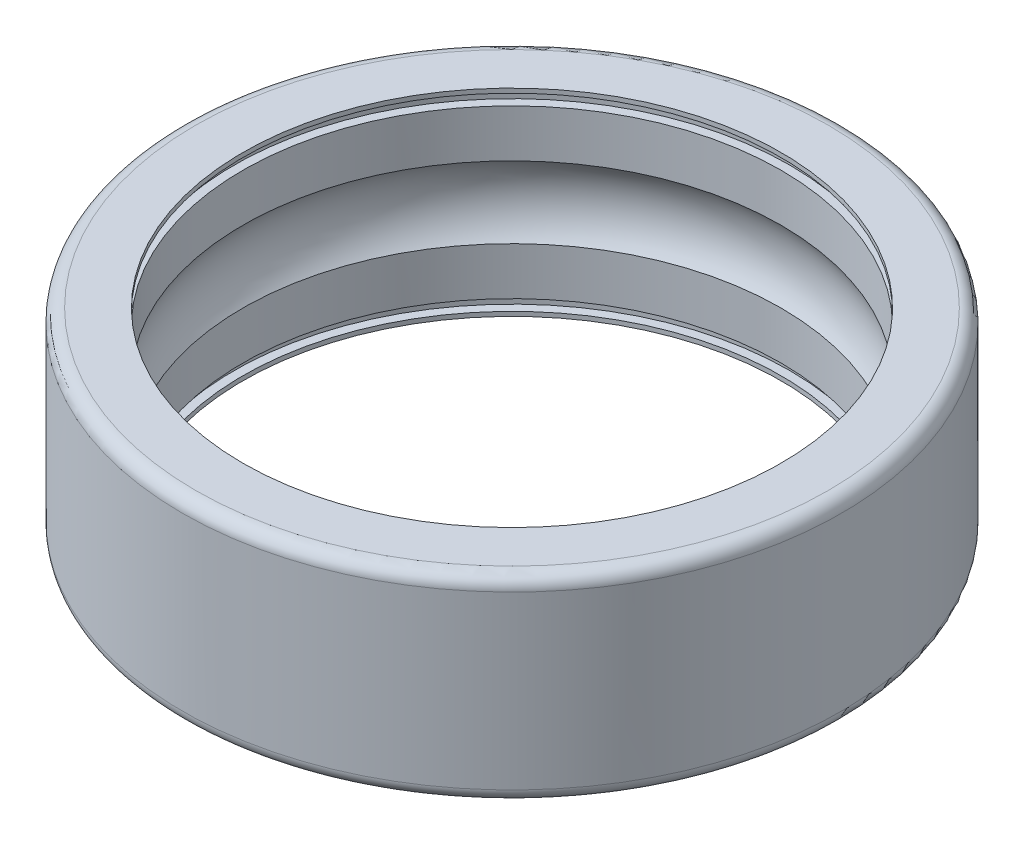
ISO-10303-21;
HEADER;
FILE_DESCRIPTION(('STEP AP214'),'2;1');
FILE_NAME('part.step','',(''),(''),'','','');
FILE_SCHEMA(('AUTOMOTIVE_DESIGN { 1 0 10303 214 1 1 1 1 }'));
ENDSEC;
DATA;
#1=APPLICATION_CONTEXT('core data for automotive mechanical design processes');
#2=APPLICATION_PROTOCOL_DEFINITION('international standard','automotive_design',2000,#1);
#3=PRODUCT_CONTEXT('',#1,'mechanical');
#4=PRODUCT('Part','Part','',(#3));
#5=PRODUCT_RELATED_PRODUCT_CATEGORY('part','',(#4));
#6=PRODUCT_DEFINITION_FORMATION('','',#4);
#7=PRODUCT_DEFINITION_CONTEXT('part definition',#1,'design');
#8=PRODUCT_DEFINITION('design','',#6,#7);
#9=PRODUCT_DEFINITION_SHAPE('','',#8);
#10=(LENGTH_UNIT() NAMED_UNIT(*) SI_UNIT(.MILLI.,.METRE.));
#11=(NAMED_UNIT(*) PLANE_ANGLE_UNIT() SI_UNIT($,.RADIAN.));
#12=(NAMED_UNIT(*) SI_UNIT($,.STERADIAN.) SOLID_ANGLE_UNIT());
#13=UNCERTAINTY_MEASURE_WITH_UNIT(LENGTH_MEASURE(1.E-05),#10,'distance_accuracy_value','');
#14=(GEOMETRIC_REPRESENTATION_CONTEXT(3) GLOBAL_UNCERTAINTY_ASSIGNED_CONTEXT((#13)) GLOBAL_UNIT_ASSIGNED_CONTEXT((#10,
#11,#12)) REPRESENTATION_CONTEXT('',''));
#15=CARTESIAN_POINT('',(0.,0.,0.));
#16=DIRECTION('',(0.,0.,1.));
#17=DIRECTION('',(1.,0.,0.));
#18=AXIS2_PLACEMENT_3D('',#15,#16,#17);
#19=CARTESIAN_POINT('',(0.,0.,0.));
#20=DIRECTION('',(0.,1.,0.));
#21=DIRECTION('',(0.,0.,-1.));
#22=AXIS2_PLACEMENT_3D('',#19,#20,#21);
#23=TOROIDAL_SURFACE('',#22,10.002,2.778);
#24=CARTESIAN_POINT('',(0.,1.632109064983,0.));
#25=DIRECTION('',(0.,-1.,0.));
#26=DIRECTION('',(0.,0.,-1.));
#27=AXIS2_PLACEMENT_3D('',#24,#25,#26);
#28=CIRCLE('',#27,12.25);
#29=CARTESIAN_POINT('',(0.,1.632109064983,12.25));
#30=VERTEX_POINT('',#29);
#31=EDGE_CURVE('E11',#30,#30,#28,.T.);
#32=ORIENTED_EDGE('',*,*,#31,.F.);
#33=EDGE_LOOP('',(#32));
#34=FACE_BOUND('',#33,.T.);
#35=CARTESIAN_POINT('',(0.,-1.632109064983,0.));
#36=DIRECTION('',(0.,1.,0.));
#37=DIRECTION('',(0.,0.,-1.));
#38=AXIS2_PLACEMENT_3D('',#35,#36,#37);
#39=CIRCLE('',#38,12.25);
#40=CARTESIAN_POINT('',(0.,-1.632109064983,-12.25));
#41=VERTEX_POINT('',#40);
#42=EDGE_CURVE('E46',#41,#41,#39,.T.);
#43=ORIENTED_EDGE('',*,*,#42,.F.);
#44=EDGE_LOOP('',(#43));
#45=FACE_BOUND('',#44,.T.);
#46=ADVANCED_FACE('F17',(#34,#45),#23,.F.);
#47=CARTESIAN_POINT('',(0.,-4.95,0.));
#48=DIRECTION('',(0.,1.,0.));
#49=DIRECTION('',(0.,0.,-1.));
#50=AXIS2_PLACEMENT_3D('',#47,#48,#49);
#51=CYLINDRICAL_SURFACE('',#50,12.25);
#52=ORIENTED_EDGE('',*,*,#31,.T.);
#53=EDGE_LOOP('',(#52));
#54=FACE_BOUND('',#53,.T.);
#55=CARTESIAN_POINT('',(0.,3.8,0.));
#56=DIRECTION('',(0.,-1.,0.));
#57=DIRECTION('',(0.,0.,-1.));
#58=AXIS2_PLACEMENT_3D('',#55,#56,#57);
#59=CIRCLE('',#58,12.25);
#60=CARTESIAN_POINT('',(0.,3.8,-12.25));
#61=VERTEX_POINT('',#60);
#62=EDGE_CURVE('E21',#61,#61,#59,.T.);
#63=ORIENTED_EDGE('',*,*,#62,.F.);
#64=EDGE_LOOP('',(#63));
#65=FACE_BOUND('',#64,.T.);
#66=ADVANCED_FACE('F179',(#54,#65),#51,.F.);
#67=CARTESIAN_POINT('',(0.,3.8,0.));
#68=DIRECTION('',(0.,1.,0.));
#69=DIRECTION('',(1.,0.,0.));
#70=AXIS2_PLACEMENT_3D('',#67,#68,#69);
#71=PLANE('',#70);
#72=CARTESIAN_POINT('',(0.,3.8,0.));
#73=DIRECTION('',(0.,1.,0.));
#74=DIRECTION('',(0.,0.,-1.));
#75=AXIS2_PLACEMENT_3D('',#72,#73,#74);
#76=CIRCLE('',#75,12.65);
#77=CARTESIAN_POINT('',(0.,3.8,12.65));
#78=VERTEX_POINT('',#77);
#79=EDGE_CURVE('E27',#78,#78,#76,.T.);
#80=ORIENTED_EDGE('',*,*,#79,.T.);
#81=EDGE_LOOP('',(#80));
#82=FACE_BOUND('',#81,.T.);
#83=ORIENTED_EDGE('',*,*,#62,.T.);
#84=EDGE_LOOP('',(#83));
#85=FACE_BOUND('',#84,.T.);
#86=ADVANCED_FACE('F184',(#82,#85),#71,.T.);
#87=CARTESIAN_POINT('',(0.,-4.95,0.));
#88=DIRECTION('',(0.,1.,0.));
#89=DIRECTION('',(0.,0.,-1.));
#90=AXIS2_PLACEMENT_3D('',#87,#88,#89);
#91=CYLINDRICAL_SURFACE('',#90,12.65);
#92=CARTESIAN_POINT('',(0.,4.3,0.));
#93=DIRECTION('',(0.,-1.,0.));
#94=DIRECTION('',(0.,0.,-1.));
#95=AXIS2_PLACEMENT_3D('',#92,#93,#94);
#96=CIRCLE('',#95,12.65);
#97=CARTESIAN_POINT('',(0.,4.3,12.65));
#98=VERTEX_POINT('',#97);
#99=EDGE_CURVE('E147',#98,#98,#96,.T.);
#100=ORIENTED_EDGE('',*,*,#99,.F.);
#101=EDGE_LOOP('',(#100));
#102=FACE_BOUND('',#101,.T.);
#103=ORIENTED_EDGE('',*,*,#79,.F.);
#104=EDGE_LOOP('',(#103));
#105=FACE_BOUND('',#104,.T.);
#106=ADVANCED_FACE('F219',(#102,#105),#91,.F.);
#107=CARTESIAN_POINT('',(0.,4.3,0.));
#108=DIRECTION('',(0.,1.,0.));
#109=DIRECTION('',(1.,0.,0.));
#110=AXIS2_PLACEMENT_3D('',#107,#108,#109);
#111=PLANE('',#110);
#112=ORIENTED_EDGE('',*,*,#99,.T.);
#113=EDGE_LOOP('',(#112));
#114=FACE_BOUND('',#113,.T.);
#115=CARTESIAN_POINT('',(0.,4.3,0.));
#116=DIRECTION('',(0.,1.,0.));
#117=DIRECTION('',(0.,0.,-1.));
#118=AXIS2_PLACEMENT_3D('',#115,#116,#117);
#119=CIRCLE('',#118,12.25);
#120=CARTESIAN_POINT('',(0.,4.3,12.25));
#121=VERTEX_POINT('',#120);
#122=EDGE_CURVE('E138',#121,#121,#119,.T.);
#123=ORIENTED_EDGE('',*,*,#122,.T.);
#124=EDGE_LOOP('',(#123));
#125=FACE_BOUND('',#124,.T.);
#126=ADVANCED_FACE('F200',(#114,#125),#111,.F.);
#127=CARTESIAN_POINT('',(0.,-4.95,0.));
#128=DIRECTION('',(0.,1.,0.));
#129=DIRECTION('',(0.,0.,-1.));
#130=AXIS2_PLACEMENT_3D('',#127,#128,#129);
#131=CYLINDRICAL_SURFACE('',#130,12.25);
#132=CARTESIAN_POINT('',(0.,4.5,0.));
#133=DIRECTION('',(0.,-1.,0.));
#134=DIRECTION('',(0.,0.,-1.));
#135=AXIS2_PLACEMENT_3D('',#132,#133,#134);
#136=CIRCLE('',#135,12.25);
#137=CARTESIAN_POINT('',(0.,4.5,12.25));
#138=VERTEX_POINT('',#137);
#139=EDGE_CURVE('E117',#138,#138,#136,.T.);
#140=ORIENTED_EDGE('',*,*,#139,.F.);
#141=EDGE_LOOP('',(#140));
#142=FACE_BOUND('',#141,.T.);
#143=ORIENTED_EDGE('',*,*,#122,.F.);
#144=EDGE_LOOP('',(#143));
#145=FACE_BOUND('',#144,.T.);
#146=ADVANCED_FACE('F192',(#142,#145),#131,.F.);
#147=CARTESIAN_POINT('',(0.,4.5,0.));
#148=DIRECTION('',(0.,1.,0.));
#149=DIRECTION('',(1.,0.,0.));
#150=AXIS2_PLACEMENT_3D('',#147,#148,#149);
#151=PLANE('',#150);
#152=CARTESIAN_POINT('',(0.,4.5,0.));
#153=DIRECTION('',(0.,1.,0.));
#154=DIRECTION('',(0.,0.,-1.));
#155=AXIS2_PLACEMENT_3D('',#152,#153,#154);
#156=CIRCLE('',#155,14.4);
#157=CARTESIAN_POINT('',(0.,4.5,14.4));
#158=VERTEX_POINT('',#157);
#159=EDGE_CURVE('E134',#158,#158,#156,.T.);
#160=ORIENTED_EDGE('',*,*,#159,.T.);
#161=EDGE_LOOP('',(#160));
#162=FACE_BOUND('',#161,.T.);
#163=ORIENTED_EDGE('',*,*,#139,.T.);
#164=EDGE_LOOP('',(#163));
#165=FACE_BOUND('',#164,.T.);
#166=ADVANCED_FACE('F189',(#162,#165),#151,.T.);
#167=CARTESIAN_POINT('',(0.,3.9,0.));
#168=DIRECTION('',(0.,1.,0.));
#169=DIRECTION('',(0.,0.,-1.));
#170=AXIS2_PLACEMENT_3D('',#167,#168,#169);
#171=TOROIDAL_SURFACE('',#170,14.4,0.6);
#172=CARTESIAN_POINT('',(0.,3.9,0.));
#173=DIRECTION('',(0.,-1.,0.));
#174=DIRECTION('',(0.,0.,-1.));
#175=AXIS2_PLACEMENT_3D('',#172,#173,#174);
#176=CIRCLE('',#175,15.);
#177=CARTESIAN_POINT('',(0.,3.9,15.));
#178=VERTEX_POINT('',#177);
#179=EDGE_CURVE('E109',#178,#178,#176,.T.);
#180=ORIENTED_EDGE('',*,*,#179,.F.);
#181=EDGE_LOOP('',(#180));
#182=FACE_BOUND('',#181,.T.);
#183=ORIENTED_EDGE('',*,*,#159,.F.);
#184=EDGE_LOOP('',(#183));
#185=FACE_BOUND('',#184,.T.);
#186=ADVANCED_FACE('F191',(#182,#185),#171,.T.);
#187=CARTESIAN_POINT('',(0.,-4.95,0.));
#188=DIRECTION('',(0.,1.,0.));
#189=DIRECTION('',(0.,0.,-1.));
#190=AXIS2_PLACEMENT_3D('',#187,#188,#189);
#191=CYLINDRICAL_SURFACE('',#190,15.);
#192=ORIENTED_EDGE('',*,*,#179,.T.);
#193=EDGE_LOOP('',(#192));
#194=FACE_BOUND('',#193,.T.);
#195=CARTESIAN_POINT('',(0.,-3.9,0.));
#196=DIRECTION('',(0.,-1.,0.));
#197=DIRECTION('',(0.,0.,-1.));
#198=AXIS2_PLACEMENT_3D('',#195,#196,#197);
#199=CIRCLE('',#198,15.);
#200=CARTESIAN_POINT('',(0.,-3.9,-15.));
#201=VERTEX_POINT('',#200);
#202=EDGE_CURVE('E105',#201,#201,#199,.T.);
#203=ORIENTED_EDGE('',*,*,#202,.F.);
#204=EDGE_LOOP('',(#203));
#205=FACE_BOUND('',#204,.T.);
#206=ADVANCED_FACE('F106',(#194,#205),#191,.T.);
#207=CARTESIAN_POINT('',(0.,-3.9,0.));
#208=DIRECTION('',(0.,1.,0.));
#209=DIRECTION('',(0.,0.,-1.));
#210=AXIS2_PLACEMENT_3D('',#207,#208,#209);
#211=TOROIDAL_SURFACE('',#210,14.4,0.6);
#212=CARTESIAN_POINT('',(0.,-4.5,0.));
#213=DIRECTION('',(0.,-1.,0.));
#214=DIRECTION('',(0.,0.,-1.));
#215=AXIS2_PLACEMENT_3D('',#212,#213,#214);
#216=CIRCLE('',#215,14.4);
#217=CARTESIAN_POINT('',(0.,-4.5,14.4));
#218=VERTEX_POINT('',#217);
#219=EDGE_CURVE('E110',#218,#218,#216,.T.);
#220=ORIENTED_EDGE('',*,*,#219,.F.);
#221=EDGE_LOOP('',(#220));
#222=FACE_BOUND('',#221,.T.);
#223=ORIENTED_EDGE('',*,*,#202,.T.);
#224=EDGE_LOOP('',(#223));
#225=FACE_BOUND('',#224,.T.);
#226=ADVANCED_FACE('F168',(#222,#225),#211,.T.);
#227=CARTESIAN_POINT('',(0.,-4.5,0.));
#228=DIRECTION('',(0.,1.,0.));
#229=DIRECTION('',(1.,0.,0.));
#230=AXIS2_PLACEMENT_3D('',#227,#228,#229);
#231=PLANE('',#230);
#232=ORIENTED_EDGE('',*,*,#219,.T.);
#233=EDGE_LOOP('',(#232));
#234=FACE_BOUND('',#233,.T.);
#235=CARTESIAN_POINT('',(0.,-4.5,0.));
#236=DIRECTION('',(0.,1.,0.));
#237=DIRECTION('',(0.,0.,-1.));
#238=AXIS2_PLACEMENT_3D('',#235,#236,#237);
#239=CIRCLE('',#238,12.25);
#240=CARTESIAN_POINT('',(0.,-4.5,12.25));
#241=VERTEX_POINT('',#240);
#242=EDGE_CURVE('E121',#241,#241,#239,.T.);
#243=ORIENTED_EDGE('',*,*,#242,.T.);
#244=EDGE_LOOP('',(#243));
#245=FACE_BOUND('',#244,.T.);
#246=ADVANCED_FACE('F163',(#234,#245),#231,.F.);
#247=CARTESIAN_POINT('',(0.,-4.95,0.));
#248=DIRECTION('',(0.,1.,0.));
#249=DIRECTION('',(0.,0.,-1.));
#250=AXIS2_PLACEMENT_3D('',#247,#248,#249);
#251=CYLINDRICAL_SURFACE('',#250,12.25);
#252=CARTESIAN_POINT('',(0.,-4.3,0.));
#253=DIRECTION('',(0.,-1.,0.));
#254=DIRECTION('',(0.,0.,-1.));
#255=AXIS2_PLACEMENT_3D('',#252,#253,#254);
#256=CIRCLE('',#255,12.25);
#257=CARTESIAN_POINT('',(0.,-4.3,12.25));
#258=VERTEX_POINT('',#257);
#259=EDGE_CURVE('E144',#258,#258,#256,.T.);
#260=ORIENTED_EDGE('',*,*,#259,.F.);
#261=EDGE_LOOP('',(#260));
#262=FACE_BOUND('',#261,.T.);
#263=ORIENTED_EDGE('',*,*,#242,.F.);
#264=EDGE_LOOP('',(#263));
#265=FACE_BOUND('',#264,.T.);
#266=ADVANCED_FACE('F19',(#262,#265),#251,.F.);
#267=CARTESIAN_POINT('',(0.,-4.3,0.));
#268=DIRECTION('',(0.,1.,0.));
#269=DIRECTION('',(1.,0.,0.));
#270=AXIS2_PLACEMENT_3D('',#267,#268,#269);
#271=PLANE('',#270);
#272=CARTESIAN_POINT('',(0.,-4.3,0.));
#273=DIRECTION('',(0.,1.,0.));
#274=DIRECTION('',(0.,0.,-1.));
#275=AXIS2_PLACEMENT_3D('',#272,#273,#274);
#276=CIRCLE('',#275,12.65);
#277=CARTESIAN_POINT('',(0.,-4.3,12.65));
#278=VERTEX_POINT('',#277);
#279=EDGE_CURVE('E82',#278,#278,#276,.T.);
#280=ORIENTED_EDGE('',*,*,#279,.T.);
#281=EDGE_LOOP('',(#280));
#282=FACE_BOUND('',#281,.T.);
#283=ORIENTED_EDGE('',*,*,#259,.T.);
#284=EDGE_LOOP('',(#283));
#285=FACE_BOUND('',#284,.T.);
#286=ADVANCED_FACE('F155',(#282,#285),#271,.T.);
#287=CARTESIAN_POINT('',(0.,-4.95,0.));
#288=DIRECTION('',(0.,1.,0.));
#289=DIRECTION('',(0.,0.,-1.));
#290=AXIS2_PLACEMENT_3D('',#287,#288,#289);
#291=CYLINDRICAL_SURFACE('',#290,12.65);
#292=CARTESIAN_POINT('',(0.,-3.8,0.));
#293=DIRECTION('',(0.,-1.,0.));
#294=DIRECTION('',(0.,0.,-1.));
#295=AXIS2_PLACEMENT_3D('',#292,#293,#294);
#296=CIRCLE('',#295,12.65);
#297=CARTESIAN_POINT('',(0.,-3.8,12.65));
#298=VERTEX_POINT('',#297);
#299=EDGE_CURVE('E92',#298,#298,#296,.T.);
#300=ORIENTED_EDGE('',*,*,#299,.F.);
#301=EDGE_LOOP('',(#300));
#302=FACE_BOUND('',#301,.T.);
#303=ORIENTED_EDGE('',*,*,#279,.F.);
#304=EDGE_LOOP('',(#303));
#305=FACE_BOUND('',#304,.T.);
#306=ADVANCED_FACE('F158',(#302,#305),#291,.F.);
#307=CARTESIAN_POINT('',(0.,-3.8,0.));
#308=DIRECTION('',(0.,1.,0.));
#309=DIRECTION('',(1.,0.,0.));
#310=AXIS2_PLACEMENT_3D('',#307,#308,#309);
#311=PLANE('',#310);
#312=ORIENTED_EDGE('',*,*,#299,.T.);
#313=EDGE_LOOP('',(#312));
#314=FACE_BOUND('',#313,.T.);
#315=CARTESIAN_POINT('',(0.,-3.8,0.));
#316=DIRECTION('',(0.,1.,0.));
#317=DIRECTION('',(0.,0.,-1.));
#318=AXIS2_PLACEMENT_3D('',#315,#316,#317);
#319=CIRCLE('',#318,12.25);
#320=CARTESIAN_POINT('',(0.,-3.8,12.25));
#321=VERTEX_POINT('',#320);
#322=EDGE_CURVE('E126',#321,#321,#319,.T.);
#323=ORIENTED_EDGE('',*,*,#322,.T.);
#324=EDGE_LOOP('',(#323));
#325=FACE_BOUND('',#324,.T.);
#326=ADVANCED_FACE('F188',(#314,#325),#311,.F.);
#327=CARTESIAN_POINT('',(0.,-4.95,0.));
#328=DIRECTION('',(0.,1.,0.));
#329=DIRECTION('',(0.,0.,-1.));
#330=AXIS2_PLACEMENT_3D('',#327,#328,#329);
#331=CYLINDRICAL_SURFACE('',#330,12.25);
#332=ORIENTED_EDGE('',*,*,#42,.T.);
#333=EDGE_LOOP('',(#332));
#334=FACE_BOUND('',#333,.T.);
#335=ORIENTED_EDGE('',*,*,#322,.F.);
#336=EDGE_LOOP('',(#335));
#337=FACE_BOUND('',#336,.T.);
#338=ADVANCED_FACE('F232',(#334,#337),#331,.F.);
#339=CLOSED_SHELL('',(#46,#66,#86,#106,#126,#146,#166,#186,#206,#226,#246,#266,#286,#306,#326,#338));
#340=MANIFOLD_SOLID_BREP('B1',#339);
#341=ADVANCED_BREP_SHAPE_REPRESENTATION('',(#18,#340),#14);
#342=SHAPE_DEFINITION_REPRESENTATION(#9,#341);
ENDSEC;
END-ISO-10303-21;
